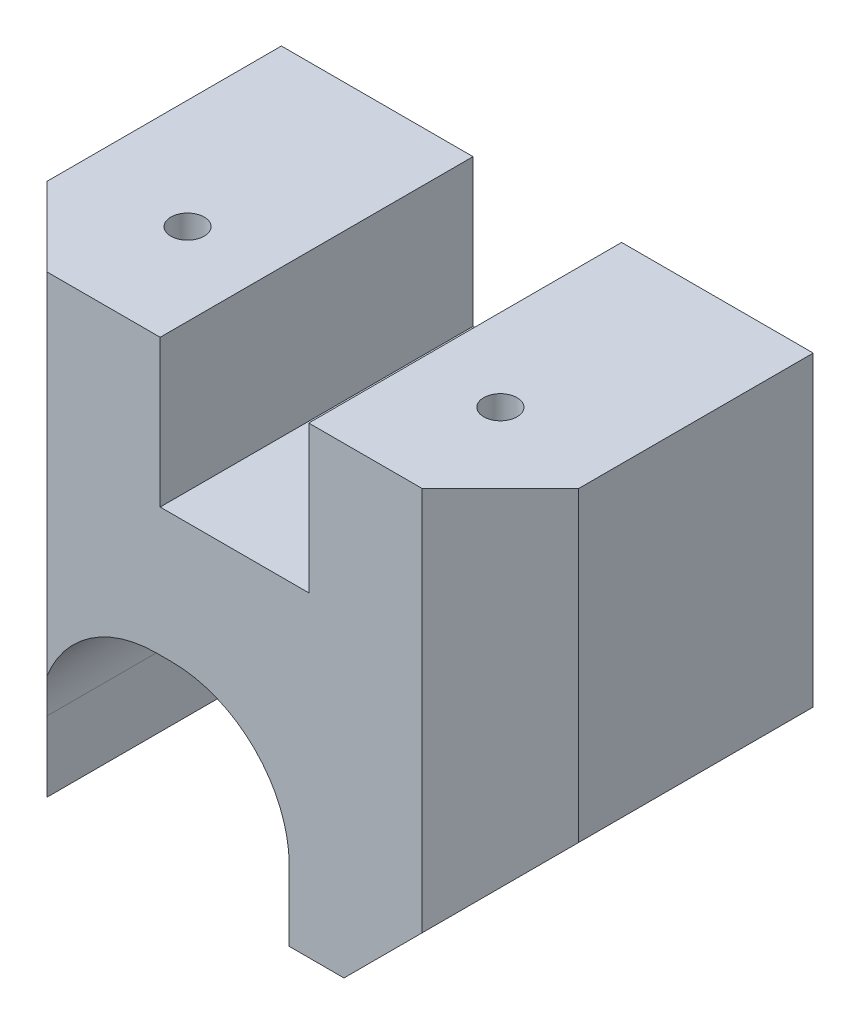
ISO-10303-21;
HEADER;
FILE_DESCRIPTION(('STEP AP214'),'2;1');
FILE_NAME('part.step','',(''),(''),'','','');
FILE_SCHEMA(('AUTOMOTIVE_DESIGN { 1 0 10303 214 1 1 1 1 }'));
ENDSEC;
DATA;
#1=APPLICATION_CONTEXT('core data for automotive mechanical design processes');
#2=APPLICATION_PROTOCOL_DEFINITION('international standard','automotive_design',2000,#1);
#3=PRODUCT_CONTEXT('',#1,'mechanical');
#4=PRODUCT('Part','Part','',(#3));
#5=PRODUCT_RELATED_PRODUCT_CATEGORY('part','',(#4));
#6=PRODUCT_DEFINITION_FORMATION('','',#4);
#7=PRODUCT_DEFINITION_CONTEXT('part definition',#1,'design');
#8=PRODUCT_DEFINITION('design','',#6,#7);
#9=PRODUCT_DEFINITION_SHAPE('','',#8);
#10=(LENGTH_UNIT() NAMED_UNIT(*) SI_UNIT(.MILLI.,.METRE.));
#11=(NAMED_UNIT(*) PLANE_ANGLE_UNIT() SI_UNIT($,.RADIAN.));
#12=(NAMED_UNIT(*) SI_UNIT($,.STERADIAN.) SOLID_ANGLE_UNIT());
#13=UNCERTAINTY_MEASURE_WITH_UNIT(LENGTH_MEASURE(1.E-05),#10,'distance_accuracy_value','');
#14=(GEOMETRIC_REPRESENTATION_CONTEXT(3) GLOBAL_UNCERTAINTY_ASSIGNED_CONTEXT((#13)) GLOBAL_UNIT_ASSIGNED_CONTEXT((#10,
#11,#12)) REPRESENTATION_CONTEXT('',''));
#15=CARTESIAN_POINT('',(0.,0.,0.));
#16=DIRECTION('',(0.,0.,1.));
#17=DIRECTION('',(1.,0.,0.));
#18=AXIS2_PLACEMENT_3D('',#15,#16,#17);
#19=CARTESIAN_POINT('',(0.,0.,0.));
#20=DIRECTION('',(0.,-1.,0.));
#21=DIRECTION('',(0.,0.,-1.));
#22=AXIS2_PLACEMENT_3D('',#19,#20,#21);
#23=PLANE('',#22);
#24=DIRECTION('',(0.,0.,-1.));
#25=VECTOR('',#24,1.);
#26=CARTESIAN_POINT('',(-15.875,0.,12.7));
#27=LINE('',#26,#25);
#28=CARTESIAN_POINT('',(-15.875,0.,12.065));
#29=VERTEX_POINT('',#28);
#30=CARTESIAN_POINT('',(-15.875,0.,-12.7));
#31=VERTEX_POINT('',#30);
#32=EDGE_CURVE('E218',#29,#31,#27,.T.);
#33=ORIENTED_EDGE('',*,*,#32,.F.);
#34=DIRECTION('',(0.707106781186547,0.,0.707106781186548));
#35=VECTOR('',#34,1.);
#36=CARTESIAN_POINT('',(-13.97,0.,13.97));
#37=LINE('',#36,#35);
#38=CARTESIAN_POINT('',(-21.59,0.,6.34999999999998));
#39=VERTEX_POINT('',#38);
#40=EDGE_CURVE('E303',#29,#39,#37,.F.);
#41=ORIENTED_EDGE('',*,*,#40,.T.);
#42=DIRECTION('',(0.,0.,1.));
#43=VECTOR('',#42,1.);
#44=CARTESIAN_POINT('',(-21.59,0.,12.7));
#45=LINE('',#44,#43);
#46=CARTESIAN_POINT('',(-21.59,0.,-12.7));
#47=VERTEX_POINT('',#46);
#48=EDGE_CURVE('E278',#47,#39,#45,.T.);
#49=ORIENTED_EDGE('',*,*,#48,.F.);
#50=DIRECTION('',(-1.,0.,0.));
#51=VECTOR('',#50,1.);
#52=CARTESIAN_POINT('',(-21.59,0.,-12.7));
#53=LINE('',#52,#51);
#54=EDGE_CURVE('E253',#31,#47,#53,.T.);
#55=ORIENTED_EDGE('',*,*,#54,.F.);
#56=EDGE_LOOP('',(#33,#41,#49,#55));
#57=FACE_BOUND('',#56,.T.);
#58=ADVANCED_FACE('F37',(#57),#23,.T.);
#59=CARTESIAN_POINT('',(0.,37.592,0.));
#60=DIRECTION('',(0.,-1.,0.));
#61=DIRECTION('',(0.,0.,-1.));
#62=AXIS2_PLACEMENT_3D('',#59,#60,#61);
#63=PLANE('',#62);
#64=CARTESIAN_POINT('',(12.7,37.592,3.81));
#65=DIRECTION('',(0.,1.,0.));
#66=DIRECTION('',(0.,0.,1.));
#67=AXIS2_PLACEMENT_3D('',#64,#65,#66);
#68=CIRCLE('',#67,1.35254999999999);
#69=CARTESIAN_POINT('',(12.7,37.592,5.16254999999999));
#70=VERTEX_POINT('',#69);
#71=EDGE_CURVE('E214',#70,#70,#68,.T.);
#72=ORIENTED_EDGE('',*,*,#71,.F.);
#73=EDGE_LOOP('',(#72));
#74=FACE_BOUND('',#73,.T.);
#75=DIRECTION('',(-1.,0.,0.));
#76=VECTOR('',#75,1.);
#77=CARTESIAN_POINT('',(-21.59,37.592,-12.7));
#78=LINE('',#77,#76);
#79=CARTESIAN_POINT('',(21.59,37.592,-12.7));
#80=VERTEX_POINT('',#79);
#81=CARTESIAN_POINT('',(6.0325,37.592,-12.7));
#82=VERTEX_POINT('',#81);
#83=EDGE_CURVE('E264',#80,#82,#78,.T.);
#84=ORIENTED_EDGE('',*,*,#83,.T.);
#85=DIRECTION('',(0.,0.,1.));
#86=VECTOR('',#85,1.);
#87=CARTESIAN_POINT('',(6.0325,37.592,-12.7));
#88=LINE('',#87,#86);
#89=CARTESIAN_POINT('',(6.0325,37.592,12.7));
#90=VERTEX_POINT('',#89);
#91=EDGE_CURVE('E244',#82,#90,#88,.T.);
#92=ORIENTED_EDGE('',*,*,#91,.T.);
#93=DIRECTION('',(1.,0.,0.));
#94=VECTOR('',#93,1.);
#95=CARTESIAN_POINT('',(-21.59,37.592,12.7));
#96=LINE('',#95,#94);
#97=CARTESIAN_POINT('',(15.24,37.592,12.7));
#98=VERTEX_POINT('',#97);
#99=EDGE_CURVE('E270',#90,#98,#96,.T.);
#100=ORIENTED_EDGE('',*,*,#99,.T.);
#101=DIRECTION('',(-0.707106781186549,0.,0.707106781186546));
#102=VECTOR('',#101,1.);
#103=CARTESIAN_POINT('',(21.59,37.592,6.35));
#104=LINE('',#103,#102);
#105=CARTESIAN_POINT('',(21.59,37.592,6.35));
#106=VERTEX_POINT('',#105);
#107=EDGE_CURVE('E307',#98,#106,#104,.F.);
#108=ORIENTED_EDGE('',*,*,#107,.T.);
#109=DIRECTION('',(0.,0.,-1.));
#110=VECTOR('',#109,1.);
#111=CARTESIAN_POINT('',(21.59,37.592,12.7));
#112=LINE('',#111,#110);
#113=EDGE_CURVE('E260',#106,#80,#112,.T.);
#114=ORIENTED_EDGE('',*,*,#113,.T.);
#115=EDGE_LOOP('',(#84,#92,#100,#108,#114));
#116=FACE_BOUND('',#115,.T.);
#117=ADVANCED_FACE('F359',(#74,#116),#63,.F.);
#118=CARTESIAN_POINT('',(21.59,37.592,12.7));
#119=DIRECTION('',(-1.,0.,0.));
#120=DIRECTION('',(0.,0.,1.));
#121=AXIS2_PLACEMENT_3D('',#118,#119,#120);
#122=PLANE('',#121);
#123=ORIENTED_EDGE('',*,*,#113,.F.);
#124=DIRECTION('',(0.,-1.,0.));
#125=VECTOR('',#124,1.);
#126=CARTESIAN_POINT('',(21.59,37.592,6.35));
#127=LINE('',#126,#125);
#128=CARTESIAN_POINT('',(21.59,12.7,6.35000000000001));
#129=VERTEX_POINT('',#128);
#130=EDGE_CURVE('E311',#106,#129,#127,.T.);
#131=ORIENTED_EDGE('',*,*,#130,.T.);
#132=DIRECTION('',(0.,0.,-1.));
#133=VECTOR('',#132,1.);
#134=CARTESIAN_POINT('',(21.59,12.7,-12.7));
#135=LINE('',#134,#133);
#136=CARTESIAN_POINT('',(21.59,12.7,-12.7));
#137=VERTEX_POINT('',#136);
#138=EDGE_CURVE('E287',#129,#137,#135,.T.);
#139=ORIENTED_EDGE('',*,*,#138,.T.);
#140=DIRECTION('',(0.,-1.,0.));
#141=VECTOR('',#140,1.);
#142=CARTESIAN_POINT('',(21.59,37.592,-12.7));
#143=LINE('',#142,#141);
#144=EDGE_CURVE('E284',#80,#137,#143,.T.);
#145=ORIENTED_EDGE('',*,*,#144,.F.);
#146=EDGE_LOOP('',(#123,#131,#139,#145));
#147=FACE_BOUND('',#146,.T.);
#148=ADVANCED_FACE('F365',(#147),#122,.F.);
#149=CARTESIAN_POINT('',(-21.59,37.592,-12.7));
#150=DIRECTION('',(0.,0.,1.));
#151=DIRECTION('',(1.,0.,0.));
#152=AXIS2_PLACEMENT_3D('',#149,#150,#151);
#153=PLANE('',#152);
#154=CARTESIAN_POINT('',(-18.215,5.71500000000001,-12.7));
#155=DIRECTION('',(0.,0.,-1.));
#156=DIRECTION('',(-1.,0.,0.));
#157=AXIS2_PLACEMENT_3D('',#154,#155,#156);
#158=CIRCLE('',#157,1.13029999999999);
#159=CARTESIAN_POINT('',(-19.3453,5.71500000000001,-12.7));
#160=VERTEX_POINT('',#159);
#161=EDGE_CURVE('E176',#160,#160,#158,.T.);
#162=ORIENTED_EDGE('',*,*,#161,.F.);
#163=EDGE_LOOP('',(#162));
#164=FACE_BOUND('',#163,.T.);
#165=CARTESIAN_POINT('',(6.78500000000001,5.715,-12.7));
#166=DIRECTION('',(0.,0.,-1.));
#167=DIRECTION('',(-1.,0.,0.));
#168=AXIS2_PLACEMENT_3D('',#165,#166,#167);
#169=CIRCLE('',#168,1.13029999999999);
#170=CARTESIAN_POINT('',(5.65470000000002,5.715,-12.7));
#171=VERTEX_POINT('',#170);
#172=EDGE_CURVE('E175',#171,#171,#169,.T.);
#173=ORIENTED_EDGE('',*,*,#172,.F.);
#174=EDGE_LOOP('',(#173));
#175=FACE_BOUND('',#174,.T.);
#176=CARTESIAN_POINT('',(-6.35,5.715,-12.7));
#177=DIRECTION('',(0.,0.,-1.));
#178=DIRECTION('',(1.,0.,0.));
#179=AXIS2_PLACEMENT_3D('',#176,#177,#178);
#180=CIRCLE('',#179,9.525);
#181=CARTESIAN_POINT('',(-15.875,5.715,-12.7));
#182=VERTEX_POINT('',#181);
#183=CARTESIAN_POINT('',(-6.35,15.24,-12.7));
#184=VERTEX_POINT('',#183);
#185=EDGE_CURVE('E207',#182,#184,#180,.T.);
#186=ORIENTED_EDGE('',*,*,#185,.F.);
#187=DIRECTION('',(0.,1.,0.));
#188=VECTOR('',#187,1.);
#189=CARTESIAN_POINT('',(-15.875,5.08,-12.7));
#190=LINE('',#189,#188);
#191=EDGE_CURVE('E205',#31,#182,#190,.T.);
#192=ORIENTED_EDGE('',*,*,#191,.F.);
#193=ORIENTED_EDGE('',*,*,#54,.T.);
#194=DIRECTION('',(0.,-1.,0.));
#195=VECTOR('',#194,1.);
#196=CARTESIAN_POINT('',(-21.59,37.592,-12.7));
#197=LINE('',#196,#195);
#198=CARTESIAN_POINT('',(-21.59,37.592,-12.7));
#199=VERTEX_POINT('',#198);
#200=EDGE_CURVE('E274',#199,#47,#197,.T.);
#201=ORIENTED_EDGE('',*,*,#200,.F.);
#202=CARTESIAN_POINT('',(-6.0325,37.592,-12.7));
#203=VERTEX_POINT('',#202);
#204=EDGE_CURVE('E262',#203,#199,#78,.T.);
#205=ORIENTED_EDGE('',*,*,#204,.F.);
#206=DIRECTION('',(0.,-1.,0.));
#207=VECTOR('',#206,1.);
#208=CARTESIAN_POINT('',(-6.0325,37.592,-12.7));
#209=LINE('',#208,#207);
#210=CARTESIAN_POINT('',(-6.0325,25.654,-12.7));
#211=VERTEX_POINT('',#210);
#212=EDGE_CURVE('E59',#203,#211,#209,.T.);
#213=ORIENTED_EDGE('',*,*,#212,.T.);
#214=DIRECTION('',(1.,0.,0.));
#215=VECTOR('',#214,1.);
#216=CARTESIAN_POINT('',(-6.0325,25.654,-12.7));
#217=LINE('',#216,#215);
#218=CARTESIAN_POINT('',(6.0325,25.654,-12.7));
#219=VERTEX_POINT('',#218);
#220=EDGE_CURVE('E241',#211,#219,#217,.T.);
#221=ORIENTED_EDGE('',*,*,#220,.T.);
#222=DIRECTION('',(0.,1.,0.));
#223=VECTOR('',#222,1.);
#224=CARTESIAN_POINT('',(6.0325,37.592,-12.7));
#225=LINE('',#224,#223);
#226=EDGE_CURVE('E236',#219,#82,#225,.T.);
#227=ORIENTED_EDGE('',*,*,#226,.T.);
#228=ORIENTED_EDGE('',*,*,#83,.F.);
#229=ORIENTED_EDGE('',*,*,#144,.T.);
#230=DIRECTION('',(-0.707106781186549,-0.707106781186546,0.));
#231=VECTOR('',#230,1.);
#232=CARTESIAN_POINT('',(21.59,12.7,-12.7));
#233=LINE('',#232,#231);
#234=CARTESIAN_POINT('',(8.88999999999995,0.,-12.7));
#235=VERTEX_POINT('',#234);
#236=EDGE_CURVE('E289',#137,#235,#233,.T.);
#237=ORIENTED_EDGE('',*,*,#236,.T.);
#238=CARTESIAN_POINT('',(4.445,0.,-12.7));
#239=VERTEX_POINT('',#238);
#240=EDGE_CURVE('E275',#235,#239,#53,.T.);
#241=ORIENTED_EDGE('',*,*,#240,.T.);
#242=DIRECTION('',(0.,-1.,0.));
#243=VECTOR('',#242,1.);
#244=CARTESIAN_POINT('',(4.445,0.,-12.7));
#245=LINE('',#244,#243);
#246=CARTESIAN_POINT('',(4.44500000000001,5.715,-12.7));
#247=VERTEX_POINT('',#246);
#248=EDGE_CURVE('E203',#247,#239,#245,.T.);
#249=ORIENTED_EDGE('',*,*,#248,.F.);
#250=CARTESIAN_POINT('',(-5.07999999999999,5.715,-12.7));
#251=DIRECTION('',(0.,0.,-1.));
#252=DIRECTION('',(1.,0.,0.));
#253=AXIS2_PLACEMENT_3D('',#250,#251,#252);
#254=CIRCLE('',#253,9.525);
#255=CARTESIAN_POINT('',(-5.07999999999999,15.24,-12.7));
#256=VERTEX_POINT('',#255);
#257=EDGE_CURVE('E186',#256,#247,#254,.T.);
#258=ORIENTED_EDGE('',*,*,#257,.F.);
#259=DIRECTION('',(1.,0.,0.));
#260=VECTOR('',#259,1.);
#261=CARTESIAN_POINT('',(-6.35,15.24,-12.7));
#262=LINE('',#261,#260);
#263=EDGE_CURVE('E191',#184,#256,#262,.T.);
#264=ORIENTED_EDGE('',*,*,#263,.F.);
#265=EDGE_LOOP('',(#186,#192,#193,#201,#205,#213,#221,#227,#228,#229,#237,#241,#249,#258,#264));
#266=FACE_BOUND('',#265,.T.);
#267=ADVANCED_FACE('F339',(#164,#175,#266),#153,.F.);
#268=CARTESIAN_POINT('',(-21.59,37.592,12.7));
#269=DIRECTION('',(1.,0.,0.));
#270=DIRECTION('',(0.,0.,-1.));
#271=AXIS2_PLACEMENT_3D('',#268,#269,#270);
#272=PLANE('',#271);
#273=ORIENTED_EDGE('',*,*,#48,.T.);
#274=DIRECTION('',(0.,1.,0.));
#275=VECTOR('',#274,1.);
#276=CARTESIAN_POINT('',(-21.59,37.592,6.34999999999998));
#277=LINE('',#276,#275);
#278=CARTESIAN_POINT('',(-21.59,37.592,6.34999999999998));
#279=VERTEX_POINT('',#278);
#280=EDGE_CURVE('E305',#39,#279,#277,.T.);
#281=ORIENTED_EDGE('',*,*,#280,.T.);
#282=DIRECTION('',(0.,0.,1.));
#283=VECTOR('',#282,1.);
#284=CARTESIAN_POINT('',(-21.59,37.592,12.7));
#285=LINE('',#284,#283);
#286=EDGE_CURVE('E267',#199,#279,#285,.T.);
#287=ORIENTED_EDGE('',*,*,#286,.F.);
#288=ORIENTED_EDGE('',*,*,#200,.T.);
#289=EDGE_LOOP('',(#273,#281,#287,#288));
#290=FACE_BOUND('',#289,.T.);
#291=ADVANCED_FACE('F331',(#290),#272,.F.);
#292=CARTESIAN_POINT('',(-21.59,37.592,12.7));
#293=DIRECTION('',(0.,0.,-1.));
#294=DIRECTION('',(-1.,0.,0.));
#295=AXIS2_PLACEMENT_3D('',#292,#293,#294);
#296=PLANE('',#295);
#297=DIRECTION('',(0.,-1.,0.));
#298=VECTOR('',#297,1.);
#299=CARTESIAN_POINT('',(-15.24,37.592,12.7));
#300=LINE('',#299,#298);
#301=CARTESIAN_POINT('',(-15.24,37.592,12.7));
#302=VERTEX_POINT('',#301);
#303=CARTESIAN_POINT('',(-15.24,9.13457965253044,12.7));
#304=VERTEX_POINT('',#303);
#305=EDGE_CURVE('E300',#302,#304,#300,.T.);
#306=ORIENTED_EDGE('',*,*,#305,.T.);
#307=CARTESIAN_POINT('',(-6.35,5.715,12.7));
#308=DIRECTION('',(0.,0.,-1.));
#309=DIRECTION('',(1.,0.,0.));
#310=AXIS2_PLACEMENT_3D('',#307,#308,#309);
#311=CIRCLE('',#310,9.525);
#312=CARTESIAN_POINT('',(-6.35,15.24,12.7));
#313=VERTEX_POINT('',#312);
#314=EDGE_CURVE('E194',#304,#313,#311,.T.);
#315=ORIENTED_EDGE('',*,*,#314,.T.);
#316=DIRECTION('',(1.,0.,0.));
#317=VECTOR('',#316,1.);
#318=CARTESIAN_POINT('',(-6.35,15.24,12.7));
#319=LINE('',#318,#317);
#320=CARTESIAN_POINT('',(-5.07999999999999,15.24,12.7));
#321=VERTEX_POINT('',#320);
#322=EDGE_CURVE('E197',#313,#321,#319,.T.);
#323=ORIENTED_EDGE('',*,*,#322,.T.);
#324=CARTESIAN_POINT('',(-5.07999999999999,5.715,12.7));
#325=DIRECTION('',(0.,0.,-1.));
#326=DIRECTION('',(1.,0.,0.));
#327=AXIS2_PLACEMENT_3D('',#324,#325,#326);
#328=CIRCLE('',#327,9.525);
#329=CARTESIAN_POINT('',(4.44500000000001,5.715,12.7));
#330=VERTEX_POINT('',#329);
#331=EDGE_CURVE('E187',#321,#330,#328,.T.);
#332=ORIENTED_EDGE('',*,*,#331,.T.);
#333=DIRECTION('',(0.,-1.,0.));
#334=VECTOR('',#333,1.);
#335=CARTESIAN_POINT('',(4.44500000000001,5.715,12.7));
#336=LINE('',#335,#334);
#337=CARTESIAN_POINT('',(4.445,0.,12.7));
#338=VERTEX_POINT('',#337);
#339=EDGE_CURVE('E190',#330,#338,#336,.T.);
#340=ORIENTED_EDGE('',*,*,#339,.T.);
#341=DIRECTION('',(1.,0.,0.));
#342=VECTOR('',#341,1.);
#343=CARTESIAN_POINT('',(-21.59,0.,12.7));
#344=LINE('',#343,#342);
#345=CARTESIAN_POINT('',(8.88999999999995,0.,12.7));
#346=VERTEX_POINT('',#345);
#347=EDGE_CURVE('E263',#338,#346,#344,.T.);
#348=ORIENTED_EDGE('',*,*,#347,.T.);
#349=DIRECTION('',(0.707106781186549,0.707106781186546,0.));
#350=VECTOR('',#349,1.);
#351=CARTESIAN_POINT('',(21.59,12.7,12.7));
#352=LINE('',#351,#350);
#353=CARTESIAN_POINT('',(15.24,6.35000000000001,12.7));
#354=VERTEX_POINT('',#353);
#355=EDGE_CURVE('E294',#346,#354,#352,.T.);
#356=ORIENTED_EDGE('',*,*,#355,.T.);
#357=DIRECTION('',(0.,1.,0.));
#358=VECTOR('',#357,1.);
#359=CARTESIAN_POINT('',(15.24,37.592,12.7));
#360=LINE('',#359,#358);
#361=EDGE_CURVE('E297',#354,#98,#360,.T.);
#362=ORIENTED_EDGE('',*,*,#361,.T.);
#363=ORIENTED_EDGE('',*,*,#99,.F.);
#364=DIRECTION('',(0.,1.,0.));
#365=VECTOR('',#364,1.);
#366=CARTESIAN_POINT('',(6.0325,37.592,12.7));
#367=LINE('',#366,#365);
#368=CARTESIAN_POINT('',(6.0325,25.654,12.7));
#369=VERTEX_POINT('',#368);
#370=EDGE_CURVE('E235',#369,#90,#367,.T.);
#371=ORIENTED_EDGE('',*,*,#370,.F.);
#372=DIRECTION('',(1.,0.,0.));
#373=VECTOR('',#372,1.);
#374=CARTESIAN_POINT('',(-6.0325,25.654,12.7));
#375=LINE('',#374,#373);
#376=CARTESIAN_POINT('',(-6.0325,25.654,12.7));
#377=VERTEX_POINT('',#376);
#378=EDGE_CURVE('E239',#377,#369,#375,.T.);
#379=ORIENTED_EDGE('',*,*,#378,.F.);
#380=DIRECTION('',(0.,-1.,0.));
#381=VECTOR('',#380,1.);
#382=CARTESIAN_POINT('',(-6.0325,37.592,12.7));
#383=LINE('',#382,#381);
#384=CARTESIAN_POINT('',(-6.0325,37.592,12.7));
#385=VERTEX_POINT('',#384);
#386=EDGE_CURVE('E246',#385,#377,#383,.T.);
#387=ORIENTED_EDGE('',*,*,#386,.F.);
#388=EDGE_CURVE('E271',#302,#385,#96,.T.);
#389=ORIENTED_EDGE('',*,*,#388,.F.);
#390=EDGE_LOOP('',(#306,#315,#323,#332,#340,#348,#356,#362,#363,#371,#379,#387,#389));
#391=FACE_BOUND('',#390,.T.);
#392=ADVANCED_FACE('F346',(#391),#296,.F.);
#393=CARTESIAN_POINT('',(-12.7,37.592,3.81));
#394=DIRECTION('',(0.,1.,0.));
#395=DIRECTION('',(0.,0.,1.));
#396=AXIS2_PLACEMENT_3D('',#393,#394,#395);
#397=CIRCLE('',#396,1.35254999999999);
#398=CARTESIAN_POINT('',(-12.7,37.592,5.16254999999999));
#399=VERTEX_POINT('',#398);
#400=EDGE_CURVE('E229',#399,#399,#397,.T.);
#401=ORIENTED_EDGE('',*,*,#400,.F.);
#402=EDGE_LOOP('',(#401));
#403=FACE_BOUND('',#402,.T.);
#404=ORIENTED_EDGE('',*,*,#388,.T.);
#405=DIRECTION('',(0.,0.,1.));
#406=VECTOR('',#405,1.);
#407=CARTESIAN_POINT('',(-6.0325,37.592,-12.7));
#408=LINE('',#407,#406);
#409=EDGE_CURVE('E256',#203,#385,#408,.T.);
#410=ORIENTED_EDGE('',*,*,#409,.F.);
#411=ORIENTED_EDGE('',*,*,#204,.T.);
#412=ORIENTED_EDGE('',*,*,#286,.T.);
#413=DIRECTION('',(-0.707106781186547,0.,-0.707106781186548));
#414=VECTOR('',#413,1.);
#415=CARTESIAN_POINT('',(-15.24,37.592,12.7));
#416=LINE('',#415,#414);
#417=EDGE_CURVE('E309',#279,#302,#416,.F.);
#418=ORIENTED_EDGE('',*,*,#417,.T.);
#419=EDGE_LOOP('',(#404,#410,#411,#412,#418));
#420=FACE_BOUND('',#419,.T.);
#421=ADVANCED_FACE('F333',(#403,#420),#63,.F.);
#422=DIRECTION('',(0.,0.,-1.));
#423=VECTOR('',#422,1.);
#424=CARTESIAN_POINT('',(4.445,0.,12.7));
#425=LINE('',#424,#423);
#426=EDGE_CURVE('E220',#338,#239,#425,.T.);
#427=ORIENTED_EDGE('',*,*,#426,.T.);
#428=ORIENTED_EDGE('',*,*,#240,.F.);
#429=DIRECTION('',(0.,0.,1.));
#430=VECTOR('',#429,1.);
#431=CARTESIAN_POINT('',(8.88999999999995,0.,12.7));
#432=LINE('',#431,#430);
#433=EDGE_CURVE('E291',#235,#346,#432,.T.);
#434=ORIENTED_EDGE('',*,*,#433,.T.);
#435=ORIENTED_EDGE('',*,*,#347,.F.);
#436=EDGE_LOOP('',(#427,#428,#434,#435));
#437=FACE_BOUND('',#436,.T.);
#438=ADVANCED_FACE('F378',(#437),#23,.T.);
#439=CARTESIAN_POINT('',(21.59,12.7,12.7));
#440=DIRECTION('',(0.707106781186546,-0.707106781186549,0.));
#441=DIRECTION('',(0.,0.,1.));
#442=AXIS2_PLACEMENT_3D('',#439,#440,#441);
#443=PLANE('',#442);
#444=ORIENTED_EDGE('',*,*,#138,.F.);
#445=DIRECTION('',(0.577350269189627,0.577350269189625,-0.577350269189625));
#446=VECTOR('',#445,1.);
#447=CARTESIAN_POINT('',(19.4733333333333,10.5833333333333,8.46666666666667));
#448=LINE('',#447,#446);
#449=EDGE_CURVE('E314',#129,#354,#448,.F.);
#450=ORIENTED_EDGE('',*,*,#449,.T.);
#451=ORIENTED_EDGE('',*,*,#355,.F.);
#452=ORIENTED_EDGE('',*,*,#433,.F.);
#453=ORIENTED_EDGE('',*,*,#236,.F.);
#454=EDGE_LOOP('',(#444,#450,#451,#452,#453));
#455=FACE_BOUND('',#454,.T.);
#456=ADVANCED_FACE('F371',(#455),#443,.T.);
#457=CARTESIAN_POINT('',(-15.24,37.592,12.7));
#458=DIRECTION('',(0.707106781186548,0.,-0.707106781186547));
#459=DIRECTION('',(0.,-1.,0.));
#460=AXIS2_PLACEMENT_3D('',#457,#458,#459);
#461=PLANE('',#460);
#462=CARTESIAN_POINT('',(-6.35,5.715,21.59));
#463=DIRECTION('',(0.707106781186548,0.,-0.707106781186547));
#464=DIRECTION('',(-0.707106781186547,0.,-0.707106781186548));
#465=AXIS2_PLACEMENT_3D('',#462,#463,#464);
#466=ELLIPSE('',#465,13.4703841816037,9.525);
#467=CARTESIAN_POINT('',(-15.875,5.715,12.065));
#468=VERTEX_POINT('',#467);
#469=EDGE_CURVE('E11',#304,#468,#466,.F.);
#470=ORIENTED_EDGE('',*,*,#469,.F.);
#471=ORIENTED_EDGE('',*,*,#305,.F.);
#472=ORIENTED_EDGE('',*,*,#417,.F.);
#473=ORIENTED_EDGE('',*,*,#280,.F.);
#474=ORIENTED_EDGE('',*,*,#40,.F.);
#475=DIRECTION('',(0.,1.,0.));
#476=VECTOR('',#475,1.);
#477=CARTESIAN_POINT('',(-15.8750000000002,37.592,12.0649999999998));
#478=LINE('',#477,#476);
#479=EDGE_CURVE('E45',#468,#29,#478,.F.);
#480=ORIENTED_EDGE('',*,*,#479,.F.);
#481=EDGE_LOOP('',(#470,#471,#472,#473,#474,#480));
#482=FACE_BOUND('',#481,.T.);
#483=ADVANCED_FACE('F326',(#482),#461,.F.);
#484=CARTESIAN_POINT('',(21.59,37.592,6.35));
#485=DIRECTION('',(-0.707106781186546,0.,-0.707106781186549));
#486=DIRECTION('',(0.,-1.,0.));
#487=AXIS2_PLACEMENT_3D('',#484,#485,#486);
#488=PLANE('',#487);
#489=ORIENTED_EDGE('',*,*,#107,.F.);
#490=ORIENTED_EDGE('',*,*,#361,.F.);
#491=ORIENTED_EDGE('',*,*,#449,.F.);
#492=ORIENTED_EDGE('',*,*,#130,.F.);
#493=EDGE_LOOP('',(#489,#490,#491,#492));
#494=FACE_BOUND('',#493,.T.);
#495=ADVANCED_FACE('F39',(#494),#488,.F.);
#496=CARTESIAN_POINT('',(6.0325,37.592,-12.7));
#497=DIRECTION('',(1.,0.,0.));
#498=DIRECTION('',(0.,1.,0.));
#499=AXIS2_PLACEMENT_3D('',#496,#497,#498);
#500=PLANE('',#499);
#501=ORIENTED_EDGE('',*,*,#370,.T.);
#502=ORIENTED_EDGE('',*,*,#91,.F.);
#503=ORIENTED_EDGE('',*,*,#226,.F.);
#504=DIRECTION('',(0.,0.,1.));
#505=VECTOR('',#504,1.);
#506=CARTESIAN_POINT('',(6.0325,25.654,-12.7));
#507=LINE('',#506,#505);
#508=EDGE_CURVE('E251',#219,#369,#507,.T.);
#509=ORIENTED_EDGE('',*,*,#508,.T.);
#510=EDGE_LOOP('',(#501,#502,#503,#509));
#511=FACE_BOUND('',#510,.T.);
#512=ADVANCED_FACE('F417',(#511),#500,.F.);
#513=CARTESIAN_POINT('',(-6.0325,25.654,-12.7));
#514=DIRECTION('',(0.,-1.,0.));
#515=DIRECTION('',(0.,0.,-1.));
#516=AXIS2_PLACEMENT_3D('',#513,#514,#515);
#517=PLANE('',#516);
#518=ORIENTED_EDGE('',*,*,#378,.T.);
#519=ORIENTED_EDGE('',*,*,#508,.F.);
#520=ORIENTED_EDGE('',*,*,#220,.F.);
#521=DIRECTION('',(0.,0.,1.));
#522=VECTOR('',#521,1.);
#523=CARTESIAN_POINT('',(-6.0325,25.654,-12.7));
#524=LINE('',#523,#522);
#525=EDGE_CURVE('E254',#211,#377,#524,.T.);
#526=ORIENTED_EDGE('',*,*,#525,.T.);
#527=EDGE_LOOP('',(#518,#519,#520,#526));
#528=FACE_BOUND('',#527,.T.);
#529=ADVANCED_FACE('F353',(#528),#517,.F.);
#530=CARTESIAN_POINT('',(-6.0325,37.592,-12.7));
#531=DIRECTION('',(-1.,0.,0.));
#532=DIRECTION('',(0.,-1.,0.));
#533=AXIS2_PLACEMENT_3D('',#530,#531,#532);
#534=PLANE('',#533);
#535=ORIENTED_EDGE('',*,*,#386,.T.);
#536=ORIENTED_EDGE('',*,*,#525,.F.);
#537=ORIENTED_EDGE('',*,*,#212,.F.);
#538=ORIENTED_EDGE('',*,*,#409,.T.);
#539=EDGE_LOOP('',(#535,#536,#537,#538));
#540=FACE_BOUND('',#539,.T.);
#541=ADVANCED_FACE('F350',(#540),#534,.F.);
#542=CARTESIAN_POINT('',(-12.7,23.114,3.81));
#543=DIRECTION('',(0.,1.,0.));
#544=DIRECTION('',(0.,0.,1.));
#545=AXIS2_PLACEMENT_3D('',#542,#543,#544);
#546=CONICAL_SURFACE('',#545,1.35255,1.02974425867665);
#547=CARTESIAN_POINT('',(-12.7,22.3013059697343,3.81));
#548=VERTEX_POINT('',#547);
#549=VERTEX_LOOP('',#548);
#550=FACE_BOUND('',#549,.T.);
#551=CARTESIAN_POINT('',(-12.7,23.114,3.81));
#552=DIRECTION('',(0.,1.,0.));
#553=DIRECTION('',(0.,0.,1.));
#554=AXIS2_PLACEMENT_3D('',#551,#552,#553);
#555=CIRCLE('',#554,1.35255);
#556=CARTESIAN_POINT('',(-12.7,23.114,5.16255));
#557=VERTEX_POINT('',#556);
#558=EDGE_CURVE('E232',#557,#557,#555,.T.);
#559=ORIENTED_EDGE('',*,*,#558,.T.);
#560=EDGE_LOOP('',(#559));
#561=FACE_BOUND('',#560,.T.);
#562=ADVANCED_FACE('F422',(#550,#561),#546,.F.);
#563=CARTESIAN_POINT('',(-12.7,37.592,3.81));
#564=DIRECTION('',(0.,1.,0.));
#565=DIRECTION('',(0.,0.,1.));
#566=AXIS2_PLACEMENT_3D('',#563,#564,#565);
#567=CYLINDRICAL_SURFACE('',#566,1.35254999999999);
#568=ORIENTED_EDGE('',*,*,#558,.F.);
#569=EDGE_LOOP('',(#568));
#570=FACE_BOUND('',#569,.T.);
#571=ORIENTED_EDGE('',*,*,#400,.T.);
#572=EDGE_LOOP('',(#571));
#573=FACE_BOUND('',#572,.T.);
#574=ADVANCED_FACE('F427',(#570,#573),#567,.F.);
#575=CARTESIAN_POINT('',(12.7,23.114,3.81));
#576=DIRECTION('',(0.,1.,0.));
#577=DIRECTION('',(0.,0.,1.));
#578=AXIS2_PLACEMENT_3D('',#575,#576,#577);
#579=CONICAL_SURFACE('',#578,1.35255,1.02974425867665);
#580=CARTESIAN_POINT('',(12.7,22.3013059697343,3.81));
#581=VERTEX_POINT('',#580);
#582=VERTEX_LOOP('',#581);
#583=FACE_BOUND('',#582,.T.);
#584=CARTESIAN_POINT('',(12.7,23.114,3.81));
#585=DIRECTION('',(0.,1.,0.));
#586=DIRECTION('',(0.,0.,1.));
#587=AXIS2_PLACEMENT_3D('',#584,#585,#586);
#588=CIRCLE('',#587,1.35255);
#589=CARTESIAN_POINT('',(12.7,23.114,5.16255));
#590=VERTEX_POINT('',#589);
#591=EDGE_CURVE('E226',#590,#590,#588,.T.);
#592=ORIENTED_EDGE('',*,*,#591,.T.);
#593=EDGE_LOOP('',(#592));
#594=FACE_BOUND('',#593,.T.);
#595=ADVANCED_FACE('F431',(#583,#594),#579,.F.);
#596=CARTESIAN_POINT('',(12.7,37.592,3.81));
#597=DIRECTION('',(0.,1.,0.));
#598=DIRECTION('',(0.,0.,1.));
#599=AXIS2_PLACEMENT_3D('',#596,#597,#598);
#600=CYLINDRICAL_SURFACE('',#599,1.35254999999999);
#601=ORIENTED_EDGE('',*,*,#591,.F.);
#602=EDGE_LOOP('',(#601));
#603=FACE_BOUND('',#602,.T.);
#604=ORIENTED_EDGE('',*,*,#71,.T.);
#605=EDGE_LOOP('',(#604));
#606=FACE_BOUND('',#605,.T.);
#607=ADVANCED_FACE('F394',(#603,#606),#600,.F.);
#608=CARTESIAN_POINT('',(-5.07999999999999,5.715,12.7));
#609=DIRECTION('',(0.,0.,-1.));
#610=DIRECTION('',(-1.,0.,0.));
#611=AXIS2_PLACEMENT_3D('',#608,#609,#610);
#612=CYLINDRICAL_SURFACE('',#611,9.525);
#613=ORIENTED_EDGE('',*,*,#257,.T.);
#614=DIRECTION('',(0.,0.,-1.));
#615=VECTOR('',#614,1.);
#616=CARTESIAN_POINT('',(4.44500000000001,5.715,12.7));
#617=LINE('',#616,#615);
#618=EDGE_CURVE('E200',#330,#247,#617,.T.);
#619=ORIENTED_EDGE('',*,*,#618,.F.);
#620=ORIENTED_EDGE('',*,*,#331,.F.);
#621=DIRECTION('',(0.,0.,-1.));
#622=VECTOR('',#621,1.);
#623=CARTESIAN_POINT('',(-5.07999999999999,15.24,12.7));
#624=LINE('',#623,#622);
#625=EDGE_CURVE('E212',#321,#256,#624,.T.);
#626=ORIENTED_EDGE('',*,*,#625,.T.);
#627=EDGE_LOOP('',(#613,#619,#620,#626));
#628=FACE_BOUND('',#627,.T.);
#629=ADVANCED_FACE('F384',(#628),#612,.F.);
#630=CARTESIAN_POINT('',(-6.35,15.24,12.7));
#631=DIRECTION('',(0.,1.,0.));
#632=DIRECTION('',(-1.,0.,0.));
#633=AXIS2_PLACEMENT_3D('',#630,#631,#632);
#634=PLANE('',#633);
#635=ORIENTED_EDGE('',*,*,#263,.T.);
#636=ORIENTED_EDGE('',*,*,#625,.F.);
#637=ORIENTED_EDGE('',*,*,#322,.F.);
#638=DIRECTION('',(0.,0.,-1.));
#639=VECTOR('',#638,1.);
#640=CARTESIAN_POINT('',(-6.35,15.24,12.7));
#641=LINE('',#640,#639);
#642=EDGE_CURVE('E215',#313,#184,#641,.T.);
#643=ORIENTED_EDGE('',*,*,#642,.T.);
#644=EDGE_LOOP('',(#635,#636,#637,#643));
#645=FACE_BOUND('',#644,.T.);
#646=ADVANCED_FACE('F386',(#645),#634,.F.);
#647=CARTESIAN_POINT('',(-6.35,5.715,12.7));
#648=DIRECTION('',(0.,0.,-1.));
#649=DIRECTION('',(-1.,0.,0.));
#650=AXIS2_PLACEMENT_3D('',#647,#648,#649);
#651=CYLINDRICAL_SURFACE('',#650,9.525);
#652=ORIENTED_EDGE('',*,*,#469,.T.);
#653=DIRECTION('',(0.,0.,-1.));
#654=VECTOR('',#653,1.);
#655=CARTESIAN_POINT('',(-15.875,5.715,12.7));
#656=LINE('',#655,#654);
#657=EDGE_CURVE('E52',#468,#182,#656,.T.);
#658=ORIENTED_EDGE('',*,*,#657,.T.);
#659=ORIENTED_EDGE('',*,*,#185,.T.);
#660=ORIENTED_EDGE('',*,*,#642,.F.);
#661=ORIENTED_EDGE('',*,*,#314,.F.);
#662=EDGE_LOOP('',(#652,#658,#659,#660,#661));
#663=FACE_BOUND('',#662,.T.);
#664=ADVANCED_FACE('F343',(#663),#651,.F.);
#665=CARTESIAN_POINT('',(-15.875,5.08,12.7));
#666=DIRECTION('',(-1.,0.,0.));
#667=DIRECTION('',(0.,-1.,0.));
#668=AXIS2_PLACEMENT_3D('',#665,#666,#667);
#669=PLANE('',#668);
#670=ORIENTED_EDGE('',*,*,#479,.T.);
#671=ORIENTED_EDGE('',*,*,#32,.T.);
#672=ORIENTED_EDGE('',*,*,#191,.T.);
#673=ORIENTED_EDGE('',*,*,#657,.F.);
#674=EDGE_LOOP('',(#670,#671,#672,#673));
#675=FACE_BOUND('',#674,.T.);
#676=ADVANCED_FACE('F317',(#675),#669,.F.);
#677=CARTESIAN_POINT('',(4.445,0.,12.7));
#678=DIRECTION('',(1.,0.,0.));
#679=DIRECTION('',(0.,1.,0.));
#680=AXIS2_PLACEMENT_3D('',#677,#678,#679);
#681=PLANE('',#680);
#682=ORIENTED_EDGE('',*,*,#248,.T.);
#683=ORIENTED_EDGE('',*,*,#426,.F.);
#684=ORIENTED_EDGE('',*,*,#339,.F.);
#685=ORIENTED_EDGE('',*,*,#618,.T.);
#686=EDGE_LOOP('',(#682,#683,#684,#685));
#687=FACE_BOUND('',#686,.T.);
#688=ADVANCED_FACE('F381',(#687),#681,.F.);
#689=CARTESIAN_POINT('',(6.78500000000001,5.715,-1.27));
#690=DIRECTION('',(0.,0.,-1.));
#691=DIRECTION('',(-1.,0.,0.));
#692=AXIS2_PLACEMENT_3D('',#689,#690,#691);
#693=CONICAL_SURFACE('',#692,1.1303,1.02974425867665);
#694=CARTESIAN_POINT('',(6.785,5.715,-0.590847242313147));
#695=VERTEX_POINT('',#694);
#696=VERTEX_LOOP('',#695);
#697=FACE_BOUND('',#696,.T.);
#698=CARTESIAN_POINT('',(6.78500000000001,5.715,-1.27));
#699=DIRECTION('',(0.,0.,-1.));
#700=DIRECTION('',(-1.,0.,0.));
#701=AXIS2_PLACEMENT_3D('',#698,#699,#700);
#702=CIRCLE('',#701,1.1303);
#703=CARTESIAN_POINT('',(5.65470000000001,5.715,-1.27));
#704=VERTEX_POINT('',#703);
#705=EDGE_CURVE('E179',#704,#704,#702,.T.);
#706=ORIENTED_EDGE('',*,*,#705,.T.);
#707=EDGE_LOOP('',(#706));
#708=FACE_BOUND('',#707,.T.);
#709=ADVANCED_FACE('F441',(#697,#708),#693,.F.);
#710=CARTESIAN_POINT('',(6.78500000000001,5.715,-12.7));
#711=DIRECTION('',(0.,0.,-1.));
#712=DIRECTION('',(-1.,0.,0.));
#713=AXIS2_PLACEMENT_3D('',#710,#711,#712);
#714=CYLINDRICAL_SURFACE('',#713,1.13029999999999);
#715=ORIENTED_EDGE('',*,*,#705,.F.);
#716=EDGE_LOOP('',(#715));
#717=FACE_BOUND('',#716,.T.);
#718=ORIENTED_EDGE('',*,*,#172,.T.);
#719=EDGE_LOOP('',(#718));
#720=FACE_BOUND('',#719,.T.);
#721=ADVANCED_FACE('F169',(#717,#720),#714,.F.);
#722=CARTESIAN_POINT('',(-18.215,5.71500000000001,-1.27));
#723=DIRECTION('',(0.,0.,-1.));
#724=DIRECTION('',(-1.,0.,0.));
#725=AXIS2_PLACEMENT_3D('',#722,#723,#724);
#726=CONICAL_SURFACE('',#725,1.1303,1.02974425867665);
#727=CARTESIAN_POINT('',(-18.215,5.71500000000001,-0.590847242313147));
#728=VERTEX_POINT('',#727);
#729=VERTEX_LOOP('',#728);
#730=FACE_BOUND('',#729,.T.);
#731=CARTESIAN_POINT('',(-18.215,5.71500000000001,-1.27));
#732=DIRECTION('',(0.,0.,-1.));
#733=DIRECTION('',(-1.,0.,0.));
#734=AXIS2_PLACEMENT_3D('',#731,#732,#733);
#735=CIRCLE('',#734,1.1303);
#736=CARTESIAN_POINT('',(-19.3453,5.71500000000001,-1.27));
#737=VERTEX_POINT('',#736);
#738=EDGE_CURVE('E173',#737,#737,#735,.T.);
#739=ORIENTED_EDGE('',*,*,#738,.T.);
#740=EDGE_LOOP('',(#739));
#741=FACE_BOUND('',#740,.T.);
#742=ADVANCED_FACE('F165',(#730,#741),#726,.F.);
#743=CARTESIAN_POINT('',(-18.215,5.71500000000001,-12.7));
#744=DIRECTION('',(0.,0.,-1.));
#745=DIRECTION('',(-1.,0.,0.));
#746=AXIS2_PLACEMENT_3D('',#743,#744,#745);
#747=CYLINDRICAL_SURFACE('',#746,1.13029999999999);
#748=ORIENTED_EDGE('',*,*,#738,.F.);
#749=EDGE_LOOP('',(#748));
#750=FACE_BOUND('',#749,.T.);
#751=ORIENTED_EDGE('',*,*,#161,.T.);
#752=EDGE_LOOP('',(#751));
#753=FACE_BOUND('',#752,.T.);
#754=ADVANCED_FACE('F168',(#750,#753),#747,.F.);
#755=CLOSED_SHELL('',(#58,#117,#148,#267,#291,#392,#421,#438,#456,#483,#495,#512,#529,#541,#562,
#574,#595,#607,#629,#646,#664,#676,#688,#709,#721,#742,#754));
#756=MANIFOLD_SOLID_BREP('B2',#755);
#757=ADVANCED_BREP_SHAPE_REPRESENTATION('',(#18,#756),#14);
#758=SHAPE_DEFINITION_REPRESENTATION(#9,#757);
ENDSEC;
END-ISO-10303-21;
